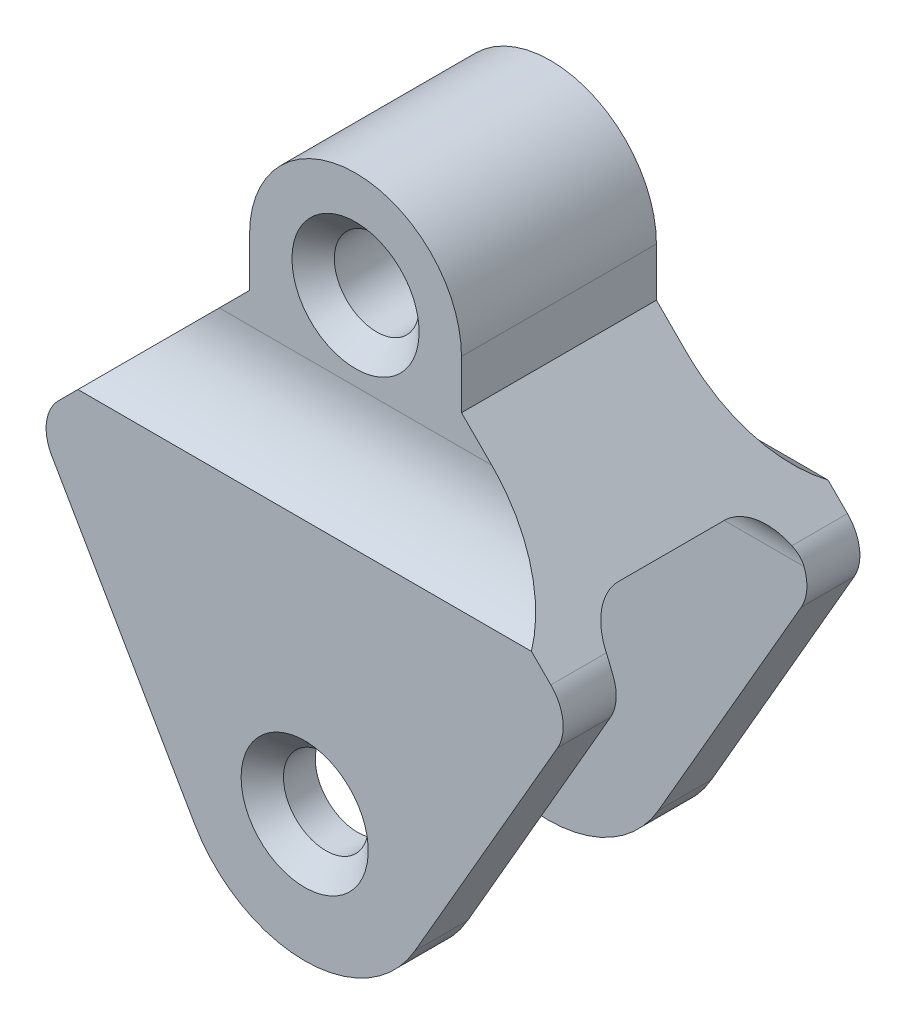
ISO-10303-21;
HEADER;
FILE_DESCRIPTION(('STEP AP214'),'2;1');
FILE_NAME('part.step','',(''),(''),'','','');
FILE_SCHEMA(('AUTOMOTIVE_DESIGN { 1 0 10303 214 1 1 1 1 }'));
ENDSEC;
DATA;
#1=APPLICATION_CONTEXT('core data for automotive mechanical design processes');
#2=APPLICATION_PROTOCOL_DEFINITION('international standard','automotive_design',2000,#1);
#3=PRODUCT_CONTEXT('',#1,'mechanical');
#4=PRODUCT('Part','Part','',(#3));
#5=PRODUCT_RELATED_PRODUCT_CATEGORY('part','',(#4));
#6=PRODUCT_DEFINITION_FORMATION('','',#4);
#7=PRODUCT_DEFINITION_CONTEXT('part definition',#1,'design');
#8=PRODUCT_DEFINITION('design','',#6,#7);
#9=PRODUCT_DEFINITION_SHAPE('','',#8);
#10=(LENGTH_UNIT() NAMED_UNIT(*) SI_UNIT(.MILLI.,.METRE.));
#11=(NAMED_UNIT(*) PLANE_ANGLE_UNIT() SI_UNIT($,.RADIAN.));
#12=(NAMED_UNIT(*) SI_UNIT($,.STERADIAN.) SOLID_ANGLE_UNIT());
#13=UNCERTAINTY_MEASURE_WITH_UNIT(LENGTH_MEASURE(1.E-05),#10,'distance_accuracy_value','');
#14=(GEOMETRIC_REPRESENTATION_CONTEXT(3) GLOBAL_UNCERTAINTY_ASSIGNED_CONTEXT((#13)) GLOBAL_UNIT_ASSIGNED_CONTEXT((#10,
#11,#12)) REPRESENTATION_CONTEXT('',''));
#15=CARTESIAN_POINT('',(0.,0.,0.));
#16=DIRECTION('',(0.,0.,1.));
#17=DIRECTION('',(1.,0.,0.));
#18=AXIS2_PLACEMENT_3D('',#15,#16,#17);
#19=CARTESIAN_POINT('',(0.,-100.,35.));
#20=DIRECTION('',(0.,0.,-1.));
#21=DIRECTION('',(-1.,0.,0.));
#22=AXIS2_PLACEMENT_3D('',#19,#20,#21);
#23=CYLINDRICAL_SURFACE('',#22,30.);
#24=CARTESIAN_POINT('',(0.,-100.,12.5));
#25=DIRECTION('',(0.,0.,1.));
#26=DIRECTION('',(1.,0.,0.));
#27=AXIS2_PLACEMENT_3D('',#24,#25,#26);
#28=CIRCLE('',#27,30.);
#29=CARTESIAN_POINT('',(-25.9807621135332,-115.,12.5));
#30=VERTEX_POINT('',#29);
#31=CARTESIAN_POINT('',(25.9807621135332,-115.,12.5));
#32=VERTEX_POINT('',#31);
#33=EDGE_CURVE('E610',#30,#32,#28,.T.);
#34=ORIENTED_EDGE('',*,*,#33,.F.);
#35=DIRECTION('',(0.,0.,-1.));
#36=VECTOR('',#35,1.);
#37=CARTESIAN_POINT('',(-25.9807621135331,-115.,35.));
#38=LINE('',#37,#36);
#39=CARTESIAN_POINT('',(-25.9807621135331,-115.,0.));
#40=VERTEX_POINT('',#39);
#41=EDGE_CURVE('E525',#30,#40,#38,.T.);
#42=ORIENTED_EDGE('',*,*,#41,.T.);
#43=CARTESIAN_POINT('',(0.,-100.,0.));
#44=DIRECTION('',(0.,0.,1.));
#45=DIRECTION('',(1.,0.,0.));
#46=AXIS2_PLACEMENT_3D('',#43,#44,#45);
#47=CIRCLE('',#46,30.);
#48=CARTESIAN_POINT('',(25.9807621135332,-115.,0.));
#49=VERTEX_POINT('',#48);
#50=EDGE_CURVE('E505',#40,#49,#47,.T.);
#51=ORIENTED_EDGE('',*,*,#50,.T.);
#52=DIRECTION('',(0.,0.,-1.));
#53=VECTOR('',#52,1.);
#54=CARTESIAN_POINT('',(25.9807621135332,-115.,35.));
#55=LINE('',#54,#53);
#56=EDGE_CURVE('E544',#32,#49,#55,.T.);
#57=ORIENTED_EDGE('',*,*,#56,.F.);
#58=EDGE_LOOP('',(#34,#42,#51,#57));
#59=FACE_BOUND('',#58,.T.);
#60=ADVANCED_FACE('F47',(#59),#23,.T.);
#61=CARTESIAN_POINT('',(63.508529610859,-50.,35.));
#62=DIRECTION('',(-0.866025403784438,0.500000000000001,0.));
#63=DIRECTION('',(-0.500000000000001,-0.866025403784438,0.));
#64=AXIS2_PLACEMENT_3D('',#61,#62,#63);
#65=PLANE('',#64);
#66=DIRECTION('',(0.500000000000001,0.866025403784438,0.));
#67=VECTOR('',#66,1.);
#68=CARTESIAN_POINT('',(25.9807621135332,-115.,12.5));
#69=LINE('',#68,#67);
#70=CARTESIAN_POINT('',(59.6718946709642,-56.6452466459918,12.5));
#71=VERTEX_POINT('',#70);
#72=EDGE_CURVE('E616',#32,#71,#69,.T.);
#73=ORIENTED_EDGE('',*,*,#72,.F.);
#74=ORIENTED_EDGE('',*,*,#56,.T.);
#75=DIRECTION('',(0.500000000000001,0.866025403784438,0.));
#76=VECTOR('',#75,1.);
#77=CARTESIAN_POINT('',(63.508529610859,-50.,0.));
#78=LINE('',#77,#76);
#79=CARTESIAN_POINT('',(59.6718946709642,-56.6452466459918,0.));
#80=VERTEX_POINT('',#79);
#81=EDGE_CURVE('E510',#49,#80,#78,.T.);
#82=ORIENTED_EDGE('',*,*,#81,.T.);
#83=DIRECTION('',(0.,0.,-1.));
#84=VECTOR('',#83,1.);
#85=CARTESIAN_POINT('',(59.6718946709642,-56.6452466459918,35.));
#86=LINE('',#85,#84);
#87=EDGE_CURVE('E561',#80,#71,#86,.F.);
#88=ORIENTED_EDGE('',*,*,#87,.T.);
#89=EDGE_LOOP('',(#73,#74,#82,#88));
#90=FACE_BOUND('',#89,.T.);
#91=ADVANCED_FACE('F385',(#90),#65,.F.);
#92=CARTESIAN_POINT('',(-63.508529610859,-50.,35.));
#93=DIRECTION('',(0.866025403784438,0.500000000000001,0.));
#94=DIRECTION('',(-0.500000000000001,0.866025403784438,0.));
#95=AXIS2_PLACEMENT_3D('',#92,#93,#94);
#96=PLANE('',#95);
#97=DIRECTION('',(0.500000000000001,-0.866025403784438,0.));
#98=VECTOR('',#97,1.);
#99=CARTESIAN_POINT('',(-59.6718946709642,-56.6452466459918,12.5));
#100=LINE('',#99,#98);
#101=CARTESIAN_POINT('',(-59.6718946709642,-56.6452466459918,12.5));
#102=VERTEX_POINT('',#101);
#103=EDGE_CURVE('E605',#102,#30,#100,.T.);
#104=ORIENTED_EDGE('',*,*,#103,.F.);
#105=DIRECTION('',(0.,0.,-1.));
#106=VECTOR('',#105,1.);
#107=CARTESIAN_POINT('',(-59.6718946709642,-56.6452466459918,35.));
#108=LINE('',#107,#106);
#109=CARTESIAN_POINT('',(-59.6718946709642,-56.6452466459918,0.));
#110=VERTEX_POINT('',#109);
#111=EDGE_CURVE('E547',#102,#110,#108,.T.);
#112=ORIENTED_EDGE('',*,*,#111,.T.);
#113=DIRECTION('',(0.500000000000001,-0.866025403784438,0.));
#114=VECTOR('',#113,1.);
#115=CARTESIAN_POINT('',(-63.508529610859,-50.,0.));
#116=LINE('',#115,#114);
#117=EDGE_CURVE('E521',#110,#40,#116,.T.);
#118=ORIENTED_EDGE('',*,*,#117,.T.);
#119=ORIENTED_EDGE('',*,*,#41,.F.);
#120=EDGE_LOOP('',(#104,#112,#118,#119));
#121=FACE_BOUND('',#120,.T.);
#122=ADVANCED_FACE('F393',(#121),#96,.F.);
#123=CARTESIAN_POINT('',(0.,-100.,35.));
#124=DIRECTION('',(0.,0.,-1.));
#125=DIRECTION('',(-1.,0.,0.));
#126=AXIS2_PLACEMENT_3D('',#123,#124,#125);
#127=CYLINDRICAL_SURFACE('',#126,10.);
#128=CARTESIAN_POINT('',(0.,-100.,5.00000000000003));
#129=DIRECTION('',(0.,0.,1.));
#130=DIRECTION('',(1.,0.,0.));
#131=AXIS2_PLACEMENT_3D('',#128,#129,#130);
#132=CIRCLE('',#131,10.);
#133=CARTESIAN_POINT('',(10.,-100.,5.00000000000003));
#134=VERTEX_POINT('',#133);
#135=EDGE_CURVE('E11',#134,#134,#132,.F.);
#136=ORIENTED_EDGE('',*,*,#135,.T.);
#137=EDGE_LOOP('',(#136));
#138=FACE_BOUND('',#137,.T.);
#139=CARTESIAN_POINT('',(0.,-100.,12.5));
#140=DIRECTION('',(0.,0.,1.));
#141=DIRECTION('',(1.,0.,0.));
#142=AXIS2_PLACEMENT_3D('',#139,#140,#141);
#143=CIRCLE('',#142,10.);
#144=CARTESIAN_POINT('',(10.,-100.,12.5));
#145=VERTEX_POINT('',#144);
#146=EDGE_CURVE('E476',#145,#145,#143,.T.);
#147=ORIENTED_EDGE('',*,*,#146,.T.);
#148=EDGE_LOOP('',(#147));
#149=FACE_BOUND('',#148,.T.);
#150=ADVANCED_FACE('F404',(#138,#149),#127,.F.);
#151=CARTESIAN_POINT('',(-51.0116406331198,-51.6452466459918,35.));
#152=DIRECTION('',(0.,0.,-1.));
#153=DIRECTION('',(-1.,0.,0.));
#154=AXIS2_PLACEMENT_3D('',#151,#152,#153);
#155=CYLINDRICAL_SURFACE('',#154,10.);
#156=ORIENTED_EDGE('',*,*,#111,.F.);
#157=CARTESIAN_POINT('',(-51.0116406331198,-51.6452466459918,12.5));
#158=DIRECTION('',(0.,0.,1.));
#159=DIRECTION('',(1.,0.,0.));
#160=AXIS2_PLACEMENT_3D('',#157,#158,#159);
#161=CIRCLE('',#160,10.);
#162=CARTESIAN_POINT('',(-60.3235779659139,-48.,12.5));
#163=VERTEX_POINT('',#162);
#164=EDGE_CURVE('E602',#163,#102,#161,.T.);
#165=ORIENTED_EDGE('',*,*,#164,.F.);
#166=CARTESIAN_POINT('',(-60.3235779659139,-48.,12.5));
#167=CARTESIAN_POINT('',(-60.2785464881514,-47.8849604470219,12.4999985243668));
#168=CARTESIAN_POINT('',(-60.2313881748293,-47.7707789296802,12.5019854960173));
#169=CARTESIAN_POINT('',(-60.1329338408412,-47.5443633211897,12.5097436967053));
#170=CARTESIAN_POINT('',(-60.0816384242965,-47.4321289486068,12.5155143741005));
#171=CARTESIAN_POINT('',(-59.9218130856145,-47.0988797770273,12.5381979218225));
#172=CARTESIAN_POINT('',(-59.8072479041464,-46.8810735430025,12.5604831300099));
#173=CARTESIAN_POINT('',(-59.5655254632652,-46.4597894437018,12.6170799586959));
#174=CARTESIAN_POINT('',(-59.4386456134956,-46.2561191187555,12.6511574640781));
#175=CARTESIAN_POINT('',(-59.1716423598614,-45.8597955009746,12.7296203094241));
#176=CARTESIAN_POINT('',(-59.0315208105396,-45.6671406714324,12.7740042072094));
#177=CARTESIAN_POINT('',(-58.7606117788685,-45.3211357618716,12.8640891113531));
#178=CARTESIAN_POINT('',(-58.6314849401041,-45.1661736115462,12.9086352180404));
#179=CARTESIAN_POINT('',(-58.3638315068915,-44.8639212966752,13.0031423620339));
#180=CARTESIAN_POINT('',(-58.2252361814002,-44.7167049333825,13.0531450224143));
#181=CARTESIAN_POINT('',(-58.0827084449852,-44.5741788341263,13.1051211109748));
#182=B_SPLINE_CURVE_WITH_KNOTS('',3,(#166,#167,#168,#169,#170,#171,#172,#173,#174,#175,#176,
#177,#178,#179,#180,#181),.UNSPECIFIED.,.F.,.F.,(4,2,2,2,2,2,2,4),(0.,0.370536574192015,
0.741019138333442,1.48119682932748,2.20745100495173,2.93360361664895,3.55290099453264,
4.1773051695429),.UNSPECIFIED.);
#183=CARTESIAN_POINT('',(-58.0827084449852,-44.5741788341263,13.1051211109748));
#184=VERTEX_POINT('',#183);
#185=EDGE_CURVE('E409',#163,#184,#182,.T.);
#186=ORIENTED_EDGE('',*,*,#185,.T.);
#187=DIRECTION('',(0.,0.,-1.));
#188=VECTOR('',#187,1.);
#189=CARTESIAN_POINT('',(-58.0827084449852,-44.5741788341263,35.));
#190=LINE('',#189,#188);
#191=CARTESIAN_POINT('',(-58.0827084449852,-44.5741788341263,0.));
#192=VERTEX_POINT('',#191);
#193=EDGE_CURVE('E72',#192,#184,#190,.F.);
#194=ORIENTED_EDGE('',*,*,#193,.F.);
#195=CARTESIAN_POINT('',(-51.0116406331198,-51.6452466459918,0.));
#196=DIRECTION('',(0.,0.,1.));
#197=DIRECTION('',(1.,0.,0.));
#198=AXIS2_PLACEMENT_3D('',#195,#196,#197);
#199=CIRCLE('',#198,10.);
#200=EDGE_CURVE('E553',#110,#192,#199,.F.);
#201=ORIENTED_EDGE('',*,*,#200,.F.);
#202=EDGE_LOOP('',(#156,#165,#186,#194,#201));
#203=FACE_BOUND('',#202,.T.);
#204=ADVANCED_FACE('F399',(#203),#155,.T.);
#205=CARTESIAN_POINT('',(51.0116406331198,-51.6452466459918,35.));
#206=DIRECTION('',(0.,0.,-1.));
#207=DIRECTION('',(-1.,0.,0.));
#208=AXIS2_PLACEMENT_3D('',#205,#206,#207);
#209=CYLINDRICAL_SURFACE('',#208,10.);
#210=DIRECTION('',(0.,0.,-1.));
#211=VECTOR('',#210,1.);
#212=CARTESIAN_POINT('',(58.0827084449853,-44.5741788341263,35.));
#213=LINE('',#212,#211);
#214=CARTESIAN_POINT('',(58.0827084449853,-44.5741788341263,13.1051211109748));
#215=VERTEX_POINT('',#214);
#216=CARTESIAN_POINT('',(58.0827084449853,-44.5741788341263,0.));
#217=VERTEX_POINT('',#216);
#218=EDGE_CURVE('E64',#215,#217,#213,.T.);
#219=ORIENTED_EDGE('',*,*,#218,.F.);
#220=CARTESIAN_POINT('',(58.0827084449853,-44.5741788341263,13.1051211109748));
#221=CARTESIAN_POINT('',(58.2517982588475,-44.7432564606363,13.043454643941));
#222=CARTESIAN_POINT('',(58.4153791869605,-44.9189797150286,12.9845621556015));
#223=CARTESIAN_POINT('',(58.7307463964158,-45.2833670399199,12.8741939763714));
#224=CARTESIAN_POINT('',(58.8825145889304,-45.4720501553651,12.8227295609862));
#225=CARTESIAN_POINT('',(59.1699358270289,-45.8574330523845,12.7302580700196));
#226=CARTESIAN_POINT('',(59.3058589967233,-46.053883498754,12.6890552464147));
#227=CARTESIAN_POINT('',(59.5639776029491,-46.457297502748,12.6175920159995));
#228=CARTESIAN_POINT('',(59.6861850415438,-46.6642516350327,12.5873219900781));
#229=CARTESIAN_POINT('',(59.8988805997981,-47.0562357560087,12.542981802462));
#230=CARTESIAN_POINT('',(59.9913860827213,-47.239975064497,12.5271766668594));
#231=CARTESIAN_POINT('',(60.1658772421842,-47.6149565646102,12.505629658655));
#232=CARTESIAN_POINT('',(60.2477613179988,-47.8062512023968,12.4999791510343));
#233=CARTESIAN_POINT('',(60.323577965914,-48.,12.5));
#234=B_SPLINE_CURVE_WITH_KNOTS('',3,(#220,#221,#222,#223,#224,#225,#226,#227,#228,#229,#230,
#231,#232,#233),.UNSPECIFIED.,.F.,.F.,(4,2,2,2,2,2,4),(0.,0.740797889089522,1.48270871159744,
2.20914308505282,2.93493674659006,3.55326996399158,4.17713922075211),.UNSPECIFIED.);
#235=CARTESIAN_POINT('',(60.323577965914,-48.,12.5));
#236=VERTEX_POINT('',#235);
#237=EDGE_CURVE('E432',#215,#236,#234,.T.);
#238=ORIENTED_EDGE('',*,*,#237,.T.);
#239=CARTESIAN_POINT('',(51.0116406331198,-51.6452466459918,12.5));
#240=DIRECTION('',(0.,0.,1.));
#241=DIRECTION('',(-1.,0.,0.));
#242=AXIS2_PLACEMENT_3D('',#239,#240,#241);
#243=CIRCLE('',#242,10.);
#244=EDGE_CURVE('E596',#71,#236,#243,.T.);
#245=ORIENTED_EDGE('',*,*,#244,.F.);
#246=ORIENTED_EDGE('',*,*,#87,.F.);
#247=CARTESIAN_POINT('',(51.0116406331198,-51.6452466459918,0.));
#248=DIRECTION('',(0.,0.,1.));
#249=DIRECTION('',(1.,0.,0.));
#250=AXIS2_PLACEMENT_3D('',#247,#248,#249);
#251=CIRCLE('',#250,10.);
#252=EDGE_CURVE('E550',#217,#80,#251,.F.);
#253=ORIENTED_EDGE('',*,*,#252,.F.);
#254=EDGE_LOOP('',(#219,#238,#245,#246,#253));
#255=FACE_BOUND('',#254,.T.);
#256=ADVANCED_FACE('F403',(#255),#209,.T.);
#257=CARTESIAN_POINT('',(25.,0.,35.));
#258=DIRECTION('',(-1.,0.,0.));
#259=DIRECTION('',(0.,-1.,0.));
#260=AXIS2_PLACEMENT_3D('',#257,#258,#259);
#261=PLANE('',#260);
#262=DIRECTION('',(0.,-1.,0.));
#263=VECTOR('',#262,1.);
#264=CARTESIAN_POINT('',(25.,-11.4914703891411,12.));
#265=LINE('',#264,#263);
#266=CARTESIAN_POINT('',(25.,0.,12.));
#267=VERTEX_POINT('',#266);
#268=CARTESIAN_POINT('',(25.,-11.4914703891411,12.));
#269=VERTEX_POINT('',#268);
#270=EDGE_CURVE('E503',#267,#269,#265,.T.);
#271=ORIENTED_EDGE('',*,*,#270,.F.);
#272=DIRECTION('',(0.,0.,-1.));
#273=VECTOR('',#272,1.);
#274=CARTESIAN_POINT('',(25.,0.,35.));
#275=LINE('',#274,#273);
#276=CARTESIAN_POINT('',(25.,0.,58.));
#277=VERTEX_POINT('',#276);
#278=EDGE_CURVE('E536',#277,#267,#275,.T.);
#279=ORIENTED_EDGE('',*,*,#278,.F.);
#280=DIRECTION('',(0.,-1.,0.));
#281=VECTOR('',#280,1.);
#282=CARTESIAN_POINT('',(25.,-11.4914703891411,58.));
#283=LINE('',#282,#281);
#284=CARTESIAN_POINT('',(25.,-11.4914703891411,58.));
#285=VERTEX_POINT('',#284);
#286=EDGE_CURVE('E272',#277,#285,#283,.T.);
#287=ORIENTED_EDGE('',*,*,#286,.T.);
#288=DIRECTION('',(0.,0.,-1.));
#289=VECTOR('',#288,1.);
#290=CARTESIAN_POINT('',(25.,-11.4914703891411,35.));
#291=LINE('',#290,#289);
#292=EDGE_CURVE('E540',#285,#269,#291,.T.);
#293=ORIENTED_EDGE('',*,*,#292,.T.);
#294=EDGE_LOOP('',(#271,#279,#287,#293));
#295=FACE_BOUND('',#294,.T.);
#296=ADVANCED_FACE('F642',(#295),#261,.F.);
#297=CARTESIAN_POINT('',(0.,0.,35.));
#298=DIRECTION('',(0.,0.,-1.));
#299=DIRECTION('',(-1.,0.,0.));
#300=AXIS2_PLACEMENT_3D('',#297,#298,#299);
#301=CYLINDRICAL_SURFACE('',#300,25.);
#302=CARTESIAN_POINT('',(0.,0.,12.));
#303=DIRECTION('',(0.,0.,-1.));
#304=DIRECTION('',(-1.,0.,0.));
#305=AXIS2_PLACEMENT_3D('',#302,#303,#304);
#306=CIRCLE('',#305,25.);
#307=CARTESIAN_POINT('',(-25.,0.,12.));
#308=VERTEX_POINT('',#307);
#309=EDGE_CURVE('E500',#308,#267,#306,.T.);
#310=ORIENTED_EDGE('',*,*,#309,.F.);
#311=DIRECTION('',(0.,0.,-1.));
#312=VECTOR('',#311,1.);
#313=CARTESIAN_POINT('',(-25.,0.,35.));
#314=LINE('',#313,#312);
#315=CARTESIAN_POINT('',(-25.,0.,58.));
#316=VERTEX_POINT('',#315);
#317=EDGE_CURVE('E532',#316,#308,#314,.T.);
#318=ORIENTED_EDGE('',*,*,#317,.F.);
#319=CARTESIAN_POINT('',(0.,0.,58.));
#320=DIRECTION('',(0.,0.,-1.));
#321=DIRECTION('',(-1.,0.,0.));
#322=AXIS2_PLACEMENT_3D('',#319,#320,#321);
#323=CIRCLE('',#322,25.);
#324=EDGE_CURVE('E268',#316,#277,#323,.T.);
#325=ORIENTED_EDGE('',*,*,#324,.T.);
#326=ORIENTED_EDGE('',*,*,#278,.T.);
#327=EDGE_LOOP('',(#310,#318,#325,#326));
#328=FACE_BOUND('',#327,.T.);
#329=ADVANCED_FACE('F644',(#328),#301,.T.);
#330=CARTESIAN_POINT('',(-25.,0.,35.));
#331=DIRECTION('',(1.,0.,0.));
#332=DIRECTION('',(0.,0.,-1.));
#333=AXIS2_PLACEMENT_3D('',#330,#331,#332);
#334=PLANE('',#333);
#335=DIRECTION('',(0.,1.,0.));
#336=VECTOR('',#335,1.);
#337=CARTESIAN_POINT('',(-25.,-11.4914703891411,12.));
#338=LINE('',#337,#336);
#339=CARTESIAN_POINT('',(-25.,-11.4914703891411,12.));
#340=VERTEX_POINT('',#339);
#341=EDGE_CURVE('E497',#340,#308,#338,.T.);
#342=ORIENTED_EDGE('',*,*,#341,.F.);
#343=DIRECTION('',(0.,0.,-1.));
#344=VECTOR('',#343,1.);
#345=CARTESIAN_POINT('',(-25.,-11.4914703891411,35.));
#346=LINE('',#345,#344);
#347=CARTESIAN_POINT('',(-25.,-11.4914703891411,58.));
#348=VERTEX_POINT('',#347);
#349=EDGE_CURVE('E528',#348,#340,#346,.T.);
#350=ORIENTED_EDGE('',*,*,#349,.F.);
#351=DIRECTION('',(0.,1.,0.));
#352=VECTOR('',#351,1.);
#353=CARTESIAN_POINT('',(-25.,-11.4914703891411,58.));
#354=LINE('',#353,#352);
#355=EDGE_CURVE('E264',#348,#316,#354,.T.);
#356=ORIENTED_EDGE('',*,*,#355,.T.);
#357=ORIENTED_EDGE('',*,*,#317,.T.);
#358=EDGE_LOOP('',(#342,#350,#356,#357));
#359=FACE_BOUND('',#358,.T.);
#360=ADVANCED_FACE('F814',(#359),#334,.F.);
#361=CARTESIAN_POINT('',(0.,0.,35.));
#362=DIRECTION('',(0.,0.,-1.));
#363=DIRECTION('',(-1.,0.,0.));
#364=AXIS2_PLACEMENT_3D('',#361,#362,#363);
#365=CYLINDRICAL_SURFACE('',#364,10.);
#366=CARTESIAN_POINT('',(0.,0.,17.));
#367=DIRECTION('',(0.,0.,-1.));
#368=DIRECTION('',(-1.,0.,0.));
#369=AXIS2_PLACEMENT_3D('',#366,#367,#368);
#370=CIRCLE('',#369,10.);
#371=CARTESIAN_POINT('',(-10.,0.,17.));
#372=VERTEX_POINT('',#371);
#373=EDGE_CURVE('E439',#372,#372,#370,.T.);
#374=ORIENTED_EDGE('',*,*,#373,.T.);
#375=EDGE_LOOP('',(#374));
#376=FACE_BOUND('',#375,.T.);
#377=CARTESIAN_POINT('',(0.,0.,53.));
#378=DIRECTION('',(0.,0.,-1.));
#379=DIRECTION('',(-1.,0.,0.));
#380=AXIS2_PLACEMENT_3D('',#377,#378,#379);
#381=CIRCLE('',#380,10.);
#382=CARTESIAN_POINT('',(-10.,0.,53.));
#383=VERTEX_POINT('',#382);
#384=EDGE_CURVE('E367',#383,#383,#381,.T.);
#385=ORIENTED_EDGE('',*,*,#384,.F.);
#386=EDGE_LOOP('',(#385));
#387=FACE_BOUND('',#386,.T.);
#388=ADVANCED_FACE('F717',(#376,#387),#365,.F.);
#389=CARTESIAN_POINT('',(0.,-100.,0.));
#390=DIRECTION('',(0.,0.,1.));
#391=DIRECTION('',(1.,0.,0.));
#392=AXIS2_PLACEMENT_3D('',#389,#390,#391);
#393=PLANE('',#392);
#394=CARTESIAN_POINT('',(0.,-100.,0.));
#395=DIRECTION('',(0.,0.,1.));
#396=DIRECTION('',(1.,0.,0.));
#397=AXIS2_PLACEMENT_3D('',#394,#395,#396);
#398=CIRCLE('',#397,15.);
#399=CARTESIAN_POINT('',(15.,-100.,0.));
#400=VERTEX_POINT('',#399);
#401=EDGE_CURVE('E57',#400,#400,#398,.T.);
#402=ORIENTED_EDGE('',*,*,#401,.T.);
#403=EDGE_LOOP('',(#402));
#404=FACE_BOUND('',#403,.T.);
#405=DIRECTION('',(-0.707106781186549,-0.707106781186546,0.));
#406=VECTOR('',#405,1.);
#407=CARTESIAN_POINT('',(-25.,-11.4914703891411,0.));
#408=LINE('',#407,#406);
#409=CARTESIAN_POINT('',(-53.5085296108589,-40.,0.));
#410=VERTEX_POINT('',#409);
#411=EDGE_CURVE('E518',#410,#192,#408,.T.);
#412=ORIENTED_EDGE('',*,*,#411,.F.);
#413=DIRECTION('',(-1.,0.,0.));
#414=VECTOR('',#413,1.);
#415=CARTESIAN_POINT('',(53.508529610859,-40.,0.));
#416=LINE('',#415,#414);
#417=CARTESIAN_POINT('',(53.508529610859,-40.,0.));
#418=VERTEX_POINT('',#417);
#419=EDGE_CURVE('E479',#418,#410,#416,.T.);
#420=ORIENTED_EDGE('',*,*,#419,.F.);
#421=DIRECTION('',(-0.707106781186549,0.707106781186546,0.));
#422=VECTOR('',#421,1.);
#423=CARTESIAN_POINT('',(25.,-11.4914703891411,0.));
#424=LINE('',#423,#422);
#425=EDGE_CURVE('E514',#217,#418,#424,.T.);
#426=ORIENTED_EDGE('',*,*,#425,.F.);
#427=ORIENTED_EDGE('',*,*,#252,.T.);
#428=ORIENTED_EDGE('',*,*,#81,.F.);
#429=ORIENTED_EDGE('',*,*,#50,.F.);
#430=ORIENTED_EDGE('',*,*,#117,.F.);
#431=ORIENTED_EDGE('',*,*,#200,.T.);
#432=EDGE_LOOP('',(#412,#420,#426,#427,#428,#429,#430,#431));
#433=FACE_BOUND('',#432,.T.);
#434=ADVANCED_FACE('F459',(#404,#433),#393,.F.);
#435=CARTESIAN_POINT('',(25.,-11.4914703891411,35.));
#436=DIRECTION('',(-0.707106781186546,-0.707106781186549,0.));
#437=DIRECTION('',(0.707106781186549,-0.707106781186546,0.));
#438=AXIS2_PLACEMENT_3D('',#435,#436,#437);
#439=PLANE('',#438);
#440=ORIENTED_EDGE('',*,*,#292,.F.);
#441=DIRECTION('',(0.707106781186549,-0.707106781186546,0.));
#442=VECTOR('',#441,1.);
#443=CARTESIAN_POINT('',(53.508529610859,-40.,58.));
#444=LINE('',#443,#442);
#445=CARTESIAN_POINT('',(32.1543731067963,-18.6458434959374,58.));
#446=VERTEX_POINT('',#445);
#447=EDGE_CURVE('E256',#285,#446,#444,.T.);
#448=ORIENTED_EDGE('',*,*,#447,.T.);
#449=CARTESIAN_POINT('',(32.1543731067963,-18.6458434959374,83.));
#450=DIRECTION('',(0.707106781186546,0.707106781186549,0.));
#451=DIRECTION('',(-0.707106781186549,0.707106781186546,0.));
#452=AXIS2_PLACEMENT_3D('',#449,#450,#451);
#453=ELLIPSE('',#452,35.3553390593274,25.);
#454=CARTESIAN_POINT('',(53.508529610859,-40.,70.));
#455=VERTEX_POINT('',#454);
#456=EDGE_CURVE('E324',#455,#446,#453,.T.);
#457=ORIENTED_EDGE('',*,*,#456,.F.);
#458=DIRECTION('',(-0.707106781186549,0.707106781186546,0.));
#459=VECTOR('',#458,1.);
#460=CARTESIAN_POINT('',(25.,-11.4914703891411,70.));
#461=LINE('',#460,#459);
#462=CARTESIAN_POINT('',(58.0827084449853,-44.5741788341263,70.));
#463=VERTEX_POINT('',#462);
#464=EDGE_CURVE('E287',#463,#455,#461,.T.);
#465=ORIENTED_EDGE('',*,*,#464,.F.);
#466=DIRECTION('',(0.,0.,1.));
#467=VECTOR('',#466,1.);
#468=CARTESIAN_POINT('',(58.0827084449853,-44.5741788341263,35.));
#469=LINE('',#468,#467);
#470=CARTESIAN_POINT('',(58.0827084449853,-44.5741788341263,56.8948788890252));
#471=VERTEX_POINT('',#470);
#472=EDGE_CURVE('E310',#471,#463,#469,.T.);
#473=ORIENTED_EDGE('',*,*,#472,.F.);
#474=CARTESIAN_POINT('',(61.508529610859,-48.,47.5));
#475=DIRECTION('',(0.707106781186546,0.707106781186549,0.));
#476=DIRECTION('',(-0.707106781186549,0.707106781186546,0.));
#477=AXIS2_PLACEMENT_3D('',#474,#475,#476);
#478=ELLIPSE('',#477,14.142135623731,10.);
#479=CARTESIAN_POINT('',(51.508529610859,-38.,47.5));
#480=VERTEX_POINT('',#479);
#481=EDGE_CURVE('E368',#480,#471,#478,.T.);
#482=ORIENTED_EDGE('',*,*,#481,.F.);
#483=DIRECTION('',(0.,0.,1.));
#484=VECTOR('',#483,1.);
#485=CARTESIAN_POINT('',(51.508529610859,-38.,12.5));
#486=LINE('',#485,#484);
#487=CARTESIAN_POINT('',(51.508529610859,-38.,22.5));
#488=VERTEX_POINT('',#487);
#489=EDGE_CURVE('E487',#488,#480,#486,.T.);
#490=ORIENTED_EDGE('',*,*,#489,.F.);
#491=CARTESIAN_POINT('',(61.508529610859,-48.,22.5));
#492=DIRECTION('',(-0.707106781186546,-0.707106781186549,0.));
#493=DIRECTION('',(-0.707106781186549,0.707106781186546,0.));
#494=AXIS2_PLACEMENT_3D('',#491,#492,#493);
#495=ELLIPSE('',#494,14.142135623731,10.);
#496=EDGE_CURVE('E440',#488,#215,#495,.T.);
#497=ORIENTED_EDGE('',*,*,#496,.T.);
#498=ORIENTED_EDGE('',*,*,#218,.T.);
#499=ORIENTED_EDGE('',*,*,#425,.T.);
#500=CARTESIAN_POINT('',(32.1543731067963,-18.6458434959374,-13.));
#501=DIRECTION('',(-0.707106781186546,-0.707106781186549,0.));
#502=DIRECTION('',(-0.707106781186549,0.707106781186546,0.));
#503=AXIS2_PLACEMENT_3D('',#500,#501,#502);
#504=ELLIPSE('',#503,35.3553390593274,25.);
#505=CARTESIAN_POINT('',(32.1543731067963,-18.6458434959374,12.));
#506=VERTEX_POINT('',#505);
#507=EDGE_CURVE('E572',#418,#506,#504,.T.);
#508=ORIENTED_EDGE('',*,*,#507,.T.);
#509=DIRECTION('',(0.707106781186549,-0.707106781186546,0.));
#510=VECTOR('',#509,1.);
#511=CARTESIAN_POINT('',(53.508529610859,-40.,12.));
#512=LINE('',#511,#510);
#513=EDGE_CURVE('E485',#269,#506,#512,.T.);
#514=ORIENTED_EDGE('',*,*,#513,.F.);
#515=EDGE_LOOP('',(#440,#448,#457,#465,#473,#482,#490,#497,#498,#499,#508,#514));
#516=FACE_BOUND('',#515,.T.);
#517=ADVANCED_FACE('F592',(#516),#439,.F.);
#518=CARTESIAN_POINT('',(-25.,-11.4914703891411,35.));
#519=DIRECTION('',(0.707106781186546,-0.707106781186549,0.));
#520=DIRECTION('',(0.707106781186549,0.707106781186546,0.));
#521=AXIS2_PLACEMENT_3D('',#518,#519,#520);
#522=PLANE('',#521);
#523=ORIENTED_EDGE('',*,*,#193,.T.);
#524=CARTESIAN_POINT('',(-61.508529610859,-48.,22.5));
#525=DIRECTION('',(0.707106781186546,-0.707106781186549,0.));
#526=DIRECTION('',(-0.707106781186549,-0.707106781186546,0.));
#527=AXIS2_PLACEMENT_3D('',#524,#525,#526);
#528=ELLIPSE('',#527,14.142135623731,10.);
#529=CARTESIAN_POINT('',(-51.5085296108589,-38.,22.5));
#530=VERTEX_POINT('',#529);
#531=EDGE_CURVE('E418',#184,#530,#528,.T.);
#532=ORIENTED_EDGE('',*,*,#531,.T.);
#533=DIRECTION('',(0.,0.,1.));
#534=VECTOR('',#533,1.);
#535=CARTESIAN_POINT('',(-51.5085296108589,-38.,12.5));
#536=LINE('',#535,#534);
#537=CARTESIAN_POINT('',(-51.5085296108589,-38.,47.5));
#538=VERTEX_POINT('',#537);
#539=EDGE_CURVE('E480',#530,#538,#536,.T.);
#540=ORIENTED_EDGE('',*,*,#539,.T.);
#541=CARTESIAN_POINT('',(-61.508529610859,-48.,47.5));
#542=DIRECTION('',(-0.707106781186546,0.707106781186549,0.));
#543=DIRECTION('',(-0.707106781186549,-0.707106781186546,0.));
#544=AXIS2_PLACEMENT_3D('',#541,#542,#543);
#545=ELLIPSE('',#544,14.142135623731,10.);
#546=CARTESIAN_POINT('',(-58.0827084449852,-44.5741788341263,56.8948788890252));
#547=VERTEX_POINT('',#546);
#548=EDGE_CURVE('E343',#547,#538,#545,.T.);
#549=ORIENTED_EDGE('',*,*,#548,.F.);
#550=DIRECTION('',(0.,0.,1.));
#551=VECTOR('',#550,1.);
#552=CARTESIAN_POINT('',(-58.0827084449852,-44.5741788341263,35.));
#553=LINE('',#552,#551);
#554=CARTESIAN_POINT('',(-58.0827084449852,-44.5741788341263,70.));
#555=VERTEX_POINT('',#554);
#556=EDGE_CURVE('E307',#555,#547,#553,.F.);
#557=ORIENTED_EDGE('',*,*,#556,.F.);
#558=DIRECTION('',(-0.707106781186549,-0.707106781186546,0.));
#559=VECTOR('',#558,1.);
#560=CARTESIAN_POINT('',(-25.,-11.4914703891411,70.));
#561=LINE('',#560,#559);
#562=CARTESIAN_POINT('',(-53.5085296108589,-40.,70.));
#563=VERTEX_POINT('',#562);
#564=EDGE_CURVE('E291',#563,#555,#561,.T.);
#565=ORIENTED_EDGE('',*,*,#564,.F.);
#566=CARTESIAN_POINT('',(-32.1543731067963,-18.6458434959374,83.));
#567=DIRECTION('',(-0.707106781186546,0.707106781186549,0.));
#568=DIRECTION('',(-0.707106781186549,-0.707106781186546,0.));
#569=AXIS2_PLACEMENT_3D('',#566,#567,#568);
#570=ELLIPSE('',#569,35.3553390593274,25.);
#571=CARTESIAN_POINT('',(-32.1543731067962,-18.6458434959374,58.));
#572=VERTEX_POINT('',#571);
#573=EDGE_CURVE('E321',#572,#563,#570,.T.);
#574=ORIENTED_EDGE('',*,*,#573,.F.);
#575=DIRECTION('',(0.707106781186547,0.707106781186548,0.));
#576=VECTOR('',#575,1.);
#577=CARTESIAN_POINT('',(-53.5085296108589,-40.,58.));
#578=LINE('',#577,#576);
#579=EDGE_CURVE('E260',#572,#348,#578,.T.);
#580=ORIENTED_EDGE('',*,*,#579,.T.);
#581=ORIENTED_EDGE('',*,*,#349,.T.);
#582=DIRECTION('',(0.707106781186547,0.707106781186548,0.));
#583=VECTOR('',#582,1.);
#584=CARTESIAN_POINT('',(-53.5085296108589,-40.,12.));
#585=LINE('',#584,#583);
#586=CARTESIAN_POINT('',(-32.1543731067962,-18.6458434959374,12.));
#587=VERTEX_POINT('',#586);
#588=EDGE_CURVE('E494',#587,#340,#585,.T.);
#589=ORIENTED_EDGE('',*,*,#588,.F.);
#590=CARTESIAN_POINT('',(-32.1543731067963,-18.6458434959374,-13.));
#591=DIRECTION('',(0.707106781186546,-0.707106781186549,0.));
#592=DIRECTION('',(-0.707106781186549,-0.707106781186546,0.));
#593=AXIS2_PLACEMENT_3D('',#590,#591,#592);
#594=ELLIPSE('',#593,35.3553390593274,25.);
#595=EDGE_CURVE('E569',#587,#410,#594,.T.);
#596=ORIENTED_EDGE('',*,*,#595,.T.);
#597=ORIENTED_EDGE('',*,*,#411,.T.);
#598=EDGE_LOOP('',(#523,#532,#540,#549,#557,#565,#574,#580,#581,#589,#596,#597));
#599=FACE_BOUND('',#598,.T.);
#600=ADVANCED_FACE('F599',(#599),#522,.F.);
#601=CARTESIAN_POINT('',(0.,0.,12.));
#602=DIRECTION('',(0.,0.,-1.));
#603=DIRECTION('',(-1.,0.,0.));
#604=AXIS2_PLACEMENT_3D('',#601,#602,#603);
#605=PLANE('',#604);
#606=CARTESIAN_POINT('',(0.,0.,12.));
#607=DIRECTION('',(0.,0.,-1.));
#608=DIRECTION('',(-1.,0.,0.));
#609=AXIS2_PLACEMENT_3D('',#606,#607,#608);
#610=CIRCLE('',#609,15.);
#611=CARTESIAN_POINT('',(-15.,0.,12.));
#612=VERTEX_POINT('',#611);
#613=EDGE_CURVE('E444',#612,#612,#610,.F.);
#614=ORIENTED_EDGE('',*,*,#613,.T.);
#615=EDGE_LOOP('',(#614));
#616=FACE_BOUND('',#615,.T.);
#617=ORIENTED_EDGE('',*,*,#513,.T.);
#618=DIRECTION('',(1.,0.,0.));
#619=VECTOR('',#618,1.);
#620=CARTESIAN_POINT('',(-53.5085296108589,-18.6458434959374,12.));
#621=LINE('',#620,#619);
#622=EDGE_CURVE('E565',#506,#587,#621,.F.);
#623=ORIENTED_EDGE('',*,*,#622,.T.);
#624=ORIENTED_EDGE('',*,*,#588,.T.);
#625=ORIENTED_EDGE('',*,*,#341,.T.);
#626=ORIENTED_EDGE('',*,*,#309,.T.);
#627=ORIENTED_EDGE('',*,*,#270,.T.);
#628=EDGE_LOOP('',(#617,#623,#624,#625,#626,#627));
#629=FACE_BOUND('',#628,.T.);
#630=ADVANCED_FACE('F637',(#616,#629),#605,.T.);
#631=CARTESIAN_POINT('',(-51.5085296108589,-38.,12.5));
#632=DIRECTION('',(0.,1.,0.));
#633=DIRECTION('',(0.,0.,1.));
#634=AXIS2_PLACEMENT_3D('',#631,#632,#633);
#635=PLANE('',#634);
#636=ORIENTED_EDGE('',*,*,#539,.F.);
#637=DIRECTION('',(-1.,0.,0.));
#638=VECTOR('',#637,1.);
#639=CARTESIAN_POINT('',(-51.5085296108589,-38.,22.5));
#640=LINE('',#639,#638);
#641=EDGE_CURVE('E419',#530,#488,#640,.F.);
#642=ORIENTED_EDGE('',*,*,#641,.T.);
#643=ORIENTED_EDGE('',*,*,#489,.T.);
#644=DIRECTION('',(-1.,0.,0.));
#645=VECTOR('',#644,1.);
#646=CARTESIAN_POINT('',(-51.5085296108589,-38.,47.5));
#647=LINE('',#646,#645);
#648=EDGE_CURVE('E331',#538,#480,#647,.F.);
#649=ORIENTED_EDGE('',*,*,#648,.F.);
#650=EDGE_LOOP('',(#636,#642,#643,#649));
#651=FACE_BOUND('',#650,.T.);
#652=ADVANCED_FACE('F586',(#651),#635,.F.);
#653=CARTESIAN_POINT('',(-51.0116406331198,-51.6452466459918,12.5));
#654=DIRECTION('',(0.,0.,1.));
#655=DIRECTION('',(1.,0.,0.));
#656=AXIS2_PLACEMENT_3D('',#653,#654,#655);
#657=PLANE('',#656);
#658=ORIENTED_EDGE('',*,*,#146,.F.);
#659=EDGE_LOOP('',(#658));
#660=FACE_BOUND('',#659,.T.);
#661=ORIENTED_EDGE('',*,*,#244,.T.);
#662=DIRECTION('',(-1.,0.,0.));
#663=VECTOR('',#662,1.);
#664=CARTESIAN_POINT('',(-51.0116406331198,-48.,12.5));
#665=LINE('',#664,#663);
#666=EDGE_CURVE('E574',#236,#163,#665,.T.);
#667=ORIENTED_EDGE('',*,*,#666,.T.);
#668=ORIENTED_EDGE('',*,*,#164,.T.);
#669=ORIENTED_EDGE('',*,*,#103,.T.);
#670=ORIENTED_EDGE('',*,*,#33,.T.);
#671=ORIENTED_EDGE('',*,*,#72,.T.);
#672=EDGE_LOOP('',(#661,#667,#668,#669,#670,#671));
#673=FACE_BOUND('',#672,.T.);
#674=ADVANCED_FACE('F621',(#660,#673),#657,.T.);
#675=CARTESIAN_POINT('',(53.508529610859,-18.6458434959374,-13.));
#676=DIRECTION('',(-1.,0.,0.));
#677=DIRECTION('',(0.,0.,1.));
#678=AXIS2_PLACEMENT_3D('',#675,#676,#677);
#679=CYLINDRICAL_SURFACE('',#678,25.);
#680=ORIENTED_EDGE('',*,*,#507,.F.);
#681=ORIENTED_EDGE('',*,*,#419,.T.);
#682=ORIENTED_EDGE('',*,*,#595,.F.);
#683=ORIENTED_EDGE('',*,*,#622,.F.);
#684=EDGE_LOOP('',(#680,#681,#682,#683));
#685=FACE_BOUND('',#684,.T.);
#686=ADVANCED_FACE('F427',(#685),#679,.F.);
#687=CARTESIAN_POINT('',(-51.0116406331198,-48.,22.5));
#688=DIRECTION('',(-1.,0.,0.));
#689=DIRECTION('',(0.,0.,1.));
#690=AXIS2_PLACEMENT_3D('',#687,#688,#689);
#691=CYLINDRICAL_SURFACE('',#690,10.);
#692=ORIENTED_EDGE('',*,*,#496,.F.);
#693=ORIENTED_EDGE('',*,*,#641,.F.);
#694=ORIENTED_EDGE('',*,*,#531,.F.);
#695=ORIENTED_EDGE('',*,*,#185,.F.);
#696=ORIENTED_EDGE('',*,*,#666,.F.);
#697=ORIENTED_EDGE('',*,*,#237,.F.);
#698=EDGE_LOOP('',(#692,#693,#694,#695,#696,#697));
#699=FACE_BOUND('',#698,.T.);
#700=ADVANCED_FACE('F422',(#699),#691,.F.);
#701=CARTESIAN_POINT('',(0.,0.,17.));
#702=DIRECTION('',(0.,0.,-1.));
#703=DIRECTION('',(-1.,0.,0.));
#704=AXIS2_PLACEMENT_3D('',#701,#702,#703);
#705=CONICAL_SURFACE('',#704,10.,0.785398163397448);
#706=ORIENTED_EDGE('',*,*,#613,.F.);
#707=EDGE_LOOP('',(#706));
#708=FACE_BOUND('',#707,.T.);
#709=ORIENTED_EDGE('',*,*,#373,.F.);
#710=EDGE_LOOP('',(#709));
#711=FACE_BOUND('',#710,.T.);
#712=ADVANCED_FACE('F426',(#708,#711),#705,.F.);
#713=CARTESIAN_POINT('',(0.,-100.,35.));
#714=DIRECTION('',(0.,0.,1.));
#715=DIRECTION('',(-1.,0.,0.));
#716=AXIS2_PLACEMENT_3D('',#713,#714,#715);
#717=CYLINDRICAL_SURFACE('',#716,30.);
#718=CARTESIAN_POINT('',(0.,-100.,57.5));
#719=DIRECTION('',(0.,0.,1.));
#720=DIRECTION('',(1.,0.,0.));
#721=AXIS2_PLACEMENT_3D('',#718,#719,#720);
#722=CIRCLE('',#721,30.);
#723=CARTESIAN_POINT('',(-25.9807621135332,-115.,57.5));
#724=VERTEX_POINT('',#723);
#725=CARTESIAN_POINT('',(25.9807621135332,-115.,57.5));
#726=VERTEX_POINT('',#725);
#727=EDGE_CURVE('E237',#724,#726,#722,.T.);
#728=ORIENTED_EDGE('',*,*,#727,.T.);
#729=DIRECTION('',(0.,0.,1.));
#730=VECTOR('',#729,1.);
#731=CARTESIAN_POINT('',(25.9807621135332,-115.,35.));
#732=LINE('',#731,#730);
#733=CARTESIAN_POINT('',(25.9807621135332,-115.,70.));
#734=VERTEX_POINT('',#733);
#735=EDGE_CURVE('E232',#726,#734,#732,.T.);
#736=ORIENTED_EDGE('',*,*,#735,.T.);
#737=CARTESIAN_POINT('',(0.,-100.,70.));
#738=DIRECTION('',(0.,0.,1.));
#739=DIRECTION('',(1.,0.,0.));
#740=AXIS2_PLACEMENT_3D('',#737,#738,#739);
#741=CIRCLE('',#740,30.);
#742=CARTESIAN_POINT('',(-25.9807621135331,-115.,70.));
#743=VERTEX_POINT('',#742);
#744=EDGE_CURVE('E276',#743,#734,#741,.T.);
#745=ORIENTED_EDGE('',*,*,#744,.F.);
#746=DIRECTION('',(0.,0.,1.));
#747=VECTOR('',#746,1.);
#748=CARTESIAN_POINT('',(-25.9807621135331,-115.,35.));
#749=LINE('',#748,#747);
#750=EDGE_CURVE('E296',#724,#743,#749,.T.);
#751=ORIENTED_EDGE('',*,*,#750,.F.);
#752=EDGE_LOOP('',(#728,#736,#745,#751));
#753=FACE_BOUND('',#752,.T.);
#754=ADVANCED_FACE('F665',(#753),#717,.T.);
#755=CARTESIAN_POINT('',(63.508529610859,-50.,35.));
#756=DIRECTION('',(-0.866025403784438,0.500000000000001,0.));
#757=DIRECTION('',(-0.500000000000001,-0.866025403784438,0.));
#758=AXIS2_PLACEMENT_3D('',#755,#756,#757);
#759=PLANE('',#758);
#760=DIRECTION('',(0.500000000000001,0.866025403784438,0.));
#761=VECTOR('',#760,1.);
#762=CARTESIAN_POINT('',(25.9807621135332,-115.,57.5));
#763=LINE('',#762,#761);
#764=CARTESIAN_POINT('',(59.6718946709642,-56.6452466459918,57.5));
#765=VERTEX_POINT('',#764);
#766=EDGE_CURVE('E241',#726,#765,#763,.T.);
#767=ORIENTED_EDGE('',*,*,#766,.T.);
#768=DIRECTION('',(0.,0.,1.));
#769=VECTOR('',#768,1.);
#770=CARTESIAN_POINT('',(59.6718946709642,-56.6452466459918,35.));
#771=LINE('',#770,#769);
#772=CARTESIAN_POINT('',(59.6718946709642,-56.6452466459918,70.));
#773=VERTEX_POINT('',#772);
#774=EDGE_CURVE('E314',#773,#765,#771,.F.);
#775=ORIENTED_EDGE('',*,*,#774,.F.);
#776=DIRECTION('',(0.500000000000001,0.866025403784438,0.));
#777=VECTOR('',#776,1.);
#778=CARTESIAN_POINT('',(63.508529610859,-50.,70.));
#779=LINE('',#778,#777);
#780=EDGE_CURVE('E283',#734,#773,#779,.T.);
#781=ORIENTED_EDGE('',*,*,#780,.F.);
#782=ORIENTED_EDGE('',*,*,#735,.F.);
#783=EDGE_LOOP('',(#767,#775,#781,#782));
#784=FACE_BOUND('',#783,.T.);
#785=ADVANCED_FACE('F668',(#784),#759,.F.);
#786=CARTESIAN_POINT('',(-63.508529610859,-50.,35.));
#787=DIRECTION('',(0.866025403784438,0.500000000000001,0.));
#788=DIRECTION('',(-0.500000000000001,0.866025403784438,0.));
#789=AXIS2_PLACEMENT_3D('',#786,#787,#788);
#790=PLANE('',#789);
#791=DIRECTION('',(0.500000000000001,-0.866025403784438,0.));
#792=VECTOR('',#791,1.);
#793=CARTESIAN_POINT('',(-59.6718946709642,-56.6452466459918,57.5));
#794=LINE('',#793,#792);
#795=CARTESIAN_POINT('',(-59.6718946709642,-56.6452466459918,57.5));
#796=VERTEX_POINT('',#795);
#797=EDGE_CURVE('E223',#796,#724,#794,.T.);
#798=ORIENTED_EDGE('',*,*,#797,.T.);
#799=ORIENTED_EDGE('',*,*,#750,.T.);
#800=DIRECTION('',(0.500000000000001,-0.866025403784438,0.));
#801=VECTOR('',#800,1.);
#802=CARTESIAN_POINT('',(-63.508529610859,-50.,70.));
#803=LINE('',#802,#801);
#804=CARTESIAN_POINT('',(-59.6718946709642,-56.6452466459918,70.));
#805=VERTEX_POINT('',#804);
#806=EDGE_CURVE('E229',#805,#743,#803,.T.);
#807=ORIENTED_EDGE('',*,*,#806,.F.);
#808=DIRECTION('',(0.,0.,1.));
#809=VECTOR('',#808,1.);
#810=CARTESIAN_POINT('',(-59.6718946709642,-56.6452466459918,35.));
#811=LINE('',#810,#809);
#812=EDGE_CURVE('E215',#796,#805,#811,.T.);
#813=ORIENTED_EDGE('',*,*,#812,.F.);
#814=EDGE_LOOP('',(#798,#799,#807,#813));
#815=FACE_BOUND('',#814,.T.);
#816=ADVANCED_FACE('F226',(#815),#790,.F.);
#817=CARTESIAN_POINT('',(0.,-100.,35.));
#818=DIRECTION('',(0.,0.,1.));
#819=DIRECTION('',(-1.,0.,0.));
#820=AXIS2_PLACEMENT_3D('',#817,#818,#819);
#821=CYLINDRICAL_SURFACE('',#820,10.);
#822=CARTESIAN_POINT('',(0.,-100.,65.0000000000001));
#823=DIRECTION('',(0.,0.,-1.));
#824=DIRECTION('',(-1.,0.,0.));
#825=AXIS2_PLACEMENT_3D('',#822,#823,#824);
#826=CIRCLE('',#825,10.);
#827=CARTESIAN_POINT('',(-10.,-100.,65.0000000000001));
#828=VERTEX_POINT('',#827);
#829=EDGE_CURVE('E448',#828,#828,#826,.F.);
#830=ORIENTED_EDGE('',*,*,#829,.T.);
#831=EDGE_LOOP('',(#830));
#832=FACE_BOUND('',#831,.T.);
#833=CARTESIAN_POINT('',(0.,-100.,57.5));
#834=DIRECTION('',(0.,0.,1.));
#835=DIRECTION('',(1.,0.,0.));
#836=AXIS2_PLACEMENT_3D('',#833,#834,#835);
#837=CIRCLE('',#836,10.);
#838=CARTESIAN_POINT('',(10.,-100.,57.5));
#839=VERTEX_POINT('',#838);
#840=EDGE_CURVE('E251',#839,#839,#837,.T.);
#841=ORIENTED_EDGE('',*,*,#840,.F.);
#842=EDGE_LOOP('',(#841));
#843=FACE_BOUND('',#842,.T.);
#844=ADVANCED_FACE('F383',(#832,#843),#821,.F.);
#845=CARTESIAN_POINT('',(-51.0116406331198,-51.6452466459918,35.));
#846=DIRECTION('',(0.,0.,1.));
#847=DIRECTION('',(-1.,0.,0.));
#848=AXIS2_PLACEMENT_3D('',#845,#846,#847);
#849=CYLINDRICAL_SURFACE('',#848,10.);
#850=ORIENTED_EDGE('',*,*,#812,.T.);
#851=CARTESIAN_POINT('',(-51.0116406331198,-51.6452466459918,70.));
#852=DIRECTION('',(0.,0.,1.));
#853=DIRECTION('',(1.,0.,0.));
#854=AXIS2_PLACEMENT_3D('',#851,#852,#853);
#855=CIRCLE('',#854,10.);
#856=EDGE_CURVE('E304',#805,#555,#855,.F.);
#857=ORIENTED_EDGE('',*,*,#856,.T.);
#858=ORIENTED_EDGE('',*,*,#556,.T.);
#859=CARTESIAN_POINT('',(-60.3235779659139,-48.,57.5));
#860=CARTESIAN_POINT('',(-60.2785464881514,-47.8849604470219,57.5000014756332));
#861=CARTESIAN_POINT('',(-60.2313881748293,-47.7707789296802,57.4980145039827));
#862=CARTESIAN_POINT('',(-60.1329338408412,-47.5443633211897,57.4902563032947));
#863=CARTESIAN_POINT('',(-60.0816384242965,-47.4321289486068,57.4844856258995));
#864=CARTESIAN_POINT('',(-59.9218130856145,-47.0988797770273,57.4618020781775));
#865=CARTESIAN_POINT('',(-59.8072479041464,-46.8810735430025,57.4395168699901));
#866=CARTESIAN_POINT('',(-59.5655254632652,-46.4597894437018,57.3829200413041));
#867=CARTESIAN_POINT('',(-59.4386456134956,-46.2561191187555,57.3488425359219));
#868=CARTESIAN_POINT('',(-59.1716423598614,-45.8597955009746,57.2703796905759));
#869=CARTESIAN_POINT('',(-59.0315208105396,-45.6671406714324,57.2259957927906));
#870=CARTESIAN_POINT('',(-58.7606117788685,-45.3211357618716,57.1359108886469));
#871=CARTESIAN_POINT('',(-58.6314849401041,-45.1661736115462,57.0913647819596));
#872=CARTESIAN_POINT('',(-58.3638315068915,-44.8639212966752,56.9968576379661));
#873=CARTESIAN_POINT('',(-58.2252361814002,-44.7167049333825,56.9468549775858));
#874=CARTESIAN_POINT('',(-58.0827084449852,-44.5741788341263,56.8948788890252));
#875=B_SPLINE_CURVE_WITH_KNOTS('',3,(#859,#860,#861,#862,#863,#864,#865,#866,#867,#868,#869,
#870,#871,#872,#873,#874),.UNSPECIFIED.,.F.,.F.,(4,2,2,2,2,2,2,4),(0.,0.370536574192015,
0.741019138333442,1.48119682932748,2.20745100495173,2.93360361664895,3.55290099453264,
4.1773051695429),.UNSPECIFIED.);
#876=CARTESIAN_POINT('',(-60.3235779659139,-48.,57.5));
#877=VERTEX_POINT('',#876);
#878=EDGE_CURVE('E219',#877,#547,#875,.T.);
#879=ORIENTED_EDGE('',*,*,#878,.F.);
#880=CARTESIAN_POINT('',(-51.0116406331198,-51.6452466459918,57.5));
#881=DIRECTION('',(0.,0.,1.));
#882=DIRECTION('',(1.,0.,0.));
#883=AXIS2_PLACEMENT_3D('',#880,#881,#882);
#884=CIRCLE('',#883,10.);
#885=EDGE_CURVE('E211',#877,#796,#884,.T.);
#886=ORIENTED_EDGE('',*,*,#885,.T.);
#887=EDGE_LOOP('',(#850,#857,#858,#879,#886));
#888=FACE_BOUND('',#887,.T.);
#889=ADVANCED_FACE('F213',(#888),#849,.T.);
#890=CARTESIAN_POINT('',(51.0116406331198,-51.6452466459918,35.));
#891=DIRECTION('',(0.,0.,1.));
#892=DIRECTION('',(-1.,0.,0.));
#893=AXIS2_PLACEMENT_3D('',#890,#891,#892);
#894=CYLINDRICAL_SURFACE('',#893,10.);
#895=ORIENTED_EDGE('',*,*,#472,.T.);
#896=CARTESIAN_POINT('',(51.0116406331198,-51.6452466459918,70.));
#897=DIRECTION('',(0.,0.,1.));
#898=DIRECTION('',(1.,0.,0.));
#899=AXIS2_PLACEMENT_3D('',#896,#897,#898);
#900=CIRCLE('',#899,10.);
#901=EDGE_CURVE('E231',#463,#773,#900,.F.);
#902=ORIENTED_EDGE('',*,*,#901,.T.);
#903=ORIENTED_EDGE('',*,*,#774,.T.);
#904=CARTESIAN_POINT('',(51.0116406331198,-51.6452466459918,57.5));
#905=DIRECTION('',(0.,0.,1.));
#906=DIRECTION('',(-1.,0.,0.));
#907=AXIS2_PLACEMENT_3D('',#904,#905,#906);
#908=CIRCLE('',#907,10.);
#909=CARTESIAN_POINT('',(60.323577965914,-48.,57.5));
#910=VERTEX_POINT('',#909);
#911=EDGE_CURVE('E247',#765,#910,#908,.T.);
#912=ORIENTED_EDGE('',*,*,#911,.T.);
#913=CARTESIAN_POINT('',(58.0827084449853,-44.5741788341263,56.8948788890252));
#914=CARTESIAN_POINT('',(58.2517982588475,-44.7432564606363,56.956545356059));
#915=CARTESIAN_POINT('',(58.4153791869605,-44.9189797150286,57.0154378443985));
#916=CARTESIAN_POINT('',(58.7307463964158,-45.2833670399199,57.1258060236286));
#917=CARTESIAN_POINT('',(58.8825145889304,-45.4720501553651,57.1772704390138));
#918=CARTESIAN_POINT('',(59.1699358270289,-45.8574330523845,57.2697419299805));
#919=CARTESIAN_POINT('',(59.3058589967233,-46.053883498754,57.3109447535853));
#920=CARTESIAN_POINT('',(59.5639776029491,-46.457297502748,57.3824079840005));
#921=CARTESIAN_POINT('',(59.6861850415438,-46.6642516350327,57.4126780099219));
#922=CARTESIAN_POINT('',(59.8988805997981,-47.0562357560087,57.457018197538));
#923=CARTESIAN_POINT('',(59.9913860827213,-47.239975064497,57.4728233331406));
#924=CARTESIAN_POINT('',(60.1658772421842,-47.6149565646102,57.494370341345));
#925=CARTESIAN_POINT('',(60.2477613179988,-47.8062512023968,57.5000208489657));
#926=CARTESIAN_POINT('',(60.323577965914,-48.,57.5));
#927=B_SPLINE_CURVE_WITH_KNOTS('',3,(#913,#914,#915,#916,#917,#918,#919,#920,#921,#922,#923,
#924,#925,#926),.UNSPECIFIED.,.F.,.F.,(4,2,2,2,2,2,4),(0.,0.740797889089522,1.48270871159744,
2.20914308505282,2.93493674659006,3.55326996399158,4.17713922075211),.UNSPECIFIED.);
#928=EDGE_CURVE('E359',#471,#910,#927,.T.);
#929=ORIENTED_EDGE('',*,*,#928,.F.);
#930=EDGE_LOOP('',(#895,#902,#903,#912,#929));
#931=FACE_BOUND('',#930,.T.);
#932=ADVANCED_FACE('F370',(#931),#894,.T.);
#933=CARTESIAN_POINT('',(0.,-100.,70.));
#934=DIRECTION('',(0.,0.,-1.));
#935=DIRECTION('',(1.,0.,0.));
#936=AXIS2_PLACEMENT_3D('',#933,#934,#935);
#937=PLANE('',#936);
#938=CARTESIAN_POINT('',(0.,-100.,70.));
#939=DIRECTION('',(0.,0.,-1.));
#940=DIRECTION('',(-1.,0.,0.));
#941=AXIS2_PLACEMENT_3D('',#938,#939,#940);
#942=CIRCLE('',#941,15.);
#943=CARTESIAN_POINT('',(-15.,-100.,70.));
#944=VERTEX_POINT('',#943);
#945=EDGE_CURVE('E452',#944,#944,#942,.T.);
#946=ORIENTED_EDGE('',*,*,#945,.T.);
#947=EDGE_LOOP('',(#946));
#948=FACE_BOUND('',#947,.T.);
#949=ORIENTED_EDGE('',*,*,#564,.T.);
#950=ORIENTED_EDGE('',*,*,#856,.F.);
#951=ORIENTED_EDGE('',*,*,#806,.T.);
#952=ORIENTED_EDGE('',*,*,#744,.T.);
#953=ORIENTED_EDGE('',*,*,#780,.T.);
#954=ORIENTED_EDGE('',*,*,#901,.F.);
#955=ORIENTED_EDGE('',*,*,#464,.T.);
#956=DIRECTION('',(-1.,0.,0.));
#957=VECTOR('',#956,1.);
#958=CARTESIAN_POINT('',(53.508529610859,-40.,70.));
#959=LINE('',#958,#957);
#960=EDGE_CURVE('E255',#455,#563,#959,.T.);
#961=ORIENTED_EDGE('',*,*,#960,.T.);
#962=EDGE_LOOP('',(#949,#950,#951,#952,#953,#954,#955,#961));
#963=FACE_BOUND('',#962,.T.);
#964=ADVANCED_FACE('F373',(#948,#963),#937,.F.);
#965=CARTESIAN_POINT('',(0.,0.,58.));
#966=DIRECTION('',(0.,0.,1.));
#967=DIRECTION('',(-1.,0.,0.));
#968=AXIS2_PLACEMENT_3D('',#965,#966,#967);
#969=PLANE('',#968);
#970=CARTESIAN_POINT('',(0.,0.,58.));
#971=DIRECTION('',(0.,0.,-1.));
#972=DIRECTION('',(-1.,0.,0.));
#973=AXIS2_PLACEMENT_3D('',#970,#971,#972);
#974=CIRCLE('',#973,15.);
#975=CARTESIAN_POINT('',(-15.,0.,58.));
#976=VERTEX_POINT('',#975);
#977=EDGE_CURVE('E606',#976,#976,#974,.F.);
#978=ORIENTED_EDGE('',*,*,#977,.F.);
#979=EDGE_LOOP('',(#978));
#980=FACE_BOUND('',#979,.T.);
#981=ORIENTED_EDGE('',*,*,#447,.F.);
#982=ORIENTED_EDGE('',*,*,#286,.F.);
#983=ORIENTED_EDGE('',*,*,#324,.F.);
#984=ORIENTED_EDGE('',*,*,#355,.F.);
#985=ORIENTED_EDGE('',*,*,#579,.F.);
#986=DIRECTION('',(1.,0.,0.));
#987=VECTOR('',#986,1.);
#988=CARTESIAN_POINT('',(-53.5085296108589,-18.6458434959374,58.));
#989=LINE('',#988,#987);
#990=EDGE_CURVE('E318',#446,#572,#989,.F.);
#991=ORIENTED_EDGE('',*,*,#990,.F.);
#992=EDGE_LOOP('',(#981,#982,#983,#984,#985,#991));
#993=FACE_BOUND('',#992,.T.);
#994=ADVANCED_FACE('F380',(#980,#993),#969,.T.);
#995=CARTESIAN_POINT('',(-51.0116406331198,-51.6452466459918,57.5));
#996=DIRECTION('',(0.,0.,-1.));
#997=DIRECTION('',(1.,0.,0.));
#998=AXIS2_PLACEMENT_3D('',#995,#996,#997);
#999=PLANE('',#998);
#1000=ORIENTED_EDGE('',*,*,#840,.T.);
#1001=EDGE_LOOP('',(#1000));
#1002=FACE_BOUND('',#1001,.T.);
#1003=ORIENTED_EDGE('',*,*,#911,.F.);
#1004=ORIENTED_EDGE('',*,*,#766,.F.);
#1005=ORIENTED_EDGE('',*,*,#727,.F.);
#1006=ORIENTED_EDGE('',*,*,#797,.F.);
#1007=ORIENTED_EDGE('',*,*,#885,.F.);
#1008=DIRECTION('',(-1.,0.,0.));
#1009=VECTOR('',#1008,1.);
#1010=CARTESIAN_POINT('',(-51.0116406331198,-48.,57.5));
#1011=LINE('',#1010,#1009);
#1012=EDGE_CURVE('E328',#910,#877,#1011,.T.);
#1013=ORIENTED_EDGE('',*,*,#1012,.F.);
#1014=EDGE_LOOP('',(#1003,#1004,#1005,#1006,#1007,#1013));
#1015=FACE_BOUND('',#1014,.T.);
#1016=ADVANCED_FACE('F235',(#1002,#1015),#999,.T.);
#1017=CARTESIAN_POINT('',(53.508529610859,-18.6458434959374,83.));
#1018=DIRECTION('',(-1.,0.,0.));
#1019=DIRECTION('',(0.,0.,-1.));
#1020=AXIS2_PLACEMENT_3D('',#1017,#1018,#1019);
#1021=CYLINDRICAL_SURFACE('',#1020,25.);
#1022=ORIENTED_EDGE('',*,*,#456,.T.);
#1023=ORIENTED_EDGE('',*,*,#990,.T.);
#1024=ORIENTED_EDGE('',*,*,#573,.T.);
#1025=ORIENTED_EDGE('',*,*,#960,.F.);
#1026=EDGE_LOOP('',(#1022,#1023,#1024,#1025));
#1027=FACE_BOUND('',#1026,.T.);
#1028=ADVANCED_FACE('F354',(#1027),#1021,.F.);
#1029=CARTESIAN_POINT('',(-51.0116406331198,-48.,47.5));
#1030=DIRECTION('',(-1.,0.,0.));
#1031=DIRECTION('',(0.,0.,-1.));
#1032=AXIS2_PLACEMENT_3D('',#1029,#1030,#1031);
#1033=CYLINDRICAL_SURFACE('',#1032,10.);
#1034=ORIENTED_EDGE('',*,*,#481,.T.);
#1035=ORIENTED_EDGE('',*,*,#928,.T.);
#1036=ORIENTED_EDGE('',*,*,#1012,.T.);
#1037=ORIENTED_EDGE('',*,*,#878,.T.);
#1038=ORIENTED_EDGE('',*,*,#548,.T.);
#1039=ORIENTED_EDGE('',*,*,#648,.T.);
#1040=EDGE_LOOP('',(#1034,#1035,#1036,#1037,#1038,#1039));
#1041=FACE_BOUND('',#1040,.T.);
#1042=ADVANCED_FACE('F348',(#1041),#1033,.F.);
#1043=CARTESIAN_POINT('',(0.,0.,53.));
#1044=DIRECTION('',(0.,0.,1.));
#1045=DIRECTION('',(-1.,0.,0.));
#1046=AXIS2_PLACEMENT_3D('',#1043,#1044,#1045);
#1047=CONICAL_SURFACE('',#1046,10.,0.785398163397448);
#1048=ORIENTED_EDGE('',*,*,#977,.T.);
#1049=EDGE_LOOP('',(#1048));
#1050=FACE_BOUND('',#1049,.T.);
#1051=ORIENTED_EDGE('',*,*,#384,.T.);
#1052=EDGE_LOOP('',(#1051));
#1053=FACE_BOUND('',#1052,.T.);
#1054=ADVANCED_FACE('F353',(#1050,#1053),#1047,.F.);
#1055=CARTESIAN_POINT('',(0.,-100.,65.0000000000001));
#1056=DIRECTION('',(0.,0.,1.));
#1057=DIRECTION('',(1.,0.,0.));
#1058=AXIS2_PLACEMENT_3D('',#1055,#1056,#1057);
#1059=CONICAL_SURFACE('',#1058,10.,0.785398163397449);
#1060=ORIENTED_EDGE('',*,*,#945,.F.);
#1061=EDGE_LOOP('',(#1060));
#1062=FACE_BOUND('',#1061,.T.);
#1063=ORIENTED_EDGE('',*,*,#829,.F.);
#1064=EDGE_LOOP('',(#1063));
#1065=FACE_BOUND('',#1064,.T.);
#1066=ADVANCED_FACE('F463',(#1062,#1065),#1059,.F.);
#1067=CARTESIAN_POINT('',(0.,-100.,0.));
#1068=DIRECTION('',(0.,0.,-1.));
#1069=DIRECTION('',(-1.,0.,0.));
#1070=AXIS2_PLACEMENT_3D('',#1067,#1068,#1069);
#1071=CONICAL_SURFACE('',#1070,15.,0.785398163397446);
#1072=ORIENTED_EDGE('',*,*,#135,.F.);
#1073=EDGE_LOOP('',(#1072));
#1074=FACE_BOUND('',#1073,.T.);
#1075=ORIENTED_EDGE('',*,*,#401,.F.);
#1076=EDGE_LOOP('',(#1075));
#1077=FACE_BOUND('',#1076,.T.);
#1078=ADVANCED_FACE('F50',(#1074,#1077),#1071,.F.);
#1079=CLOSED_SHELL('',(#60,#91,#122,#150,#204,#256,#296,#329,#360,#388,#434,#517,#600,#630,#652,
#674,#686,#700,#712,#754,#785,#816,#844,#889,#932,#964,#994,#1016,#1028,#1042,#1054,#1066,#1078));
#1080=MANIFOLD_SOLID_BREP('B2',#1079);
#1081=ADVANCED_BREP_SHAPE_REPRESENTATION('',(#18,#1080),#14);
#1082=SHAPE_DEFINITION_REPRESENTATION(#9,#1081);
ENDSEC;
END-ISO-10303-21;
